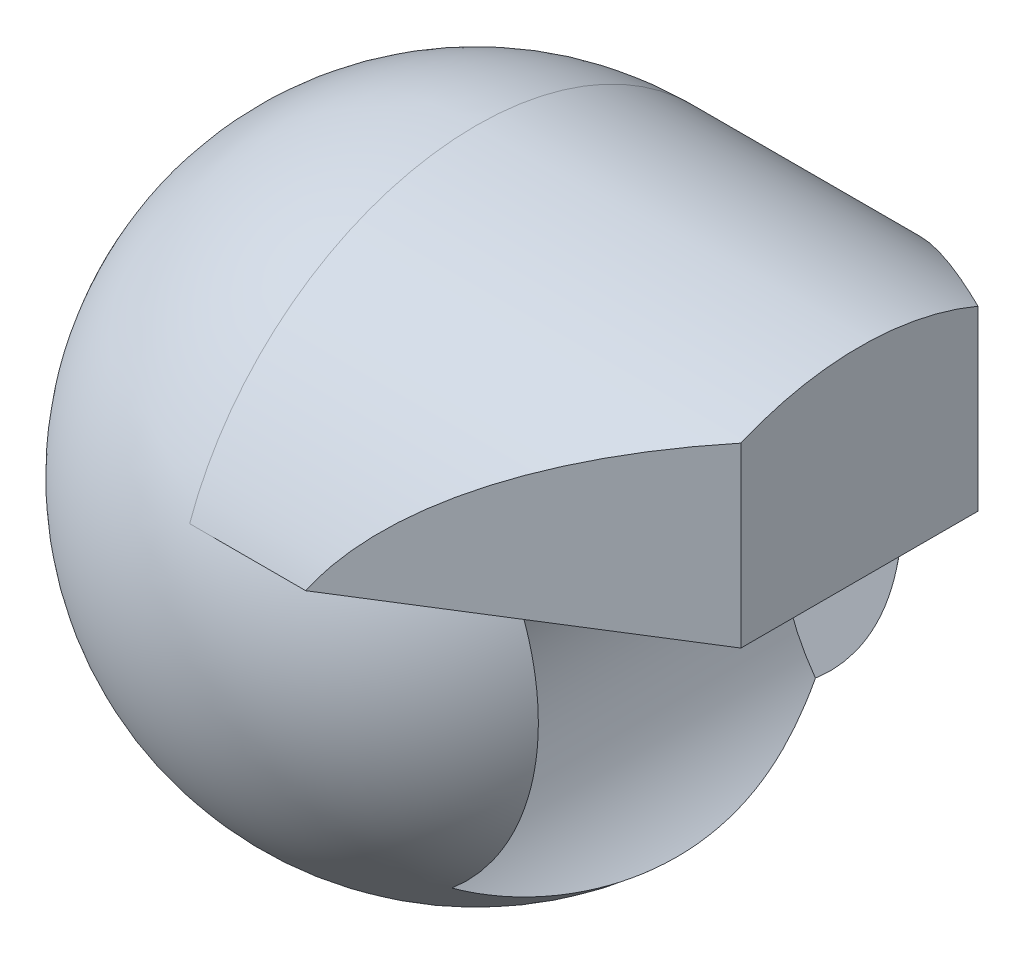
ISO-10303-21;
HEADER;
FILE_DESCRIPTION(('STEP AP214'),'2;1');
FILE_NAME('part.step','',(''),(''),'','','');
FILE_SCHEMA(('AUTOMOTIVE_DESIGN { 1 0 10303 214 1 1 1 1 }'));
ENDSEC;
DATA;
#1=APPLICATION_CONTEXT('core data for automotive mechanical design processes');
#2=APPLICATION_PROTOCOL_DEFINITION('international standard','automotive_design',2000,#1);
#3=PRODUCT_CONTEXT('',#1,'mechanical');
#4=PRODUCT('Part','Part','',(#3));
#5=PRODUCT_RELATED_PRODUCT_CATEGORY('part','',(#4));
#6=PRODUCT_DEFINITION_FORMATION('','',#4);
#7=PRODUCT_DEFINITION_CONTEXT('part definition',#1,'design');
#8=PRODUCT_DEFINITION('design','',#6,#7);
#9=PRODUCT_DEFINITION_SHAPE('','',#8);
#10=(LENGTH_UNIT() NAMED_UNIT(*) SI_UNIT(.MILLI.,.METRE.));
#11=(NAMED_UNIT(*) PLANE_ANGLE_UNIT() SI_UNIT($,.RADIAN.));
#12=(NAMED_UNIT(*) SI_UNIT($,.STERADIAN.) SOLID_ANGLE_UNIT());
#13=UNCERTAINTY_MEASURE_WITH_UNIT(LENGTH_MEASURE(1.E-05),#10,'distance_accuracy_value','');
#14=(GEOMETRIC_REPRESENTATION_CONTEXT(3) GLOBAL_UNCERTAINTY_ASSIGNED_CONTEXT((#13)) GLOBAL_UNIT_ASSIGNED_CONTEXT((#10,
#11,#12)) REPRESENTATION_CONTEXT('',''));
#15=CARTESIAN_POINT('',(0.,0.,0.));
#16=DIRECTION('',(0.,0.,1.));
#17=DIRECTION('',(1.,0.,0.));
#18=AXIS2_PLACEMENT_3D('',#15,#16,#17);
#19=CARTESIAN_POINT('',(-97.79,58.42,92.0465300812584));
#20=DIRECTION('',(0.,-1.,0.));
#21=DIRECTION('',(0.,0.,-1.));
#22=AXIS2_PLACEMENT_3D('',#19,#20,#21);
#23=PLANE('',#22);
#24=DIRECTION('',(-0.846795240839696,0.,0.531918997678445));
#25=VECTOR('',#24,1.);
#26=CARTESIAN_POINT('',(-87.2338353662045,58.42,108.851551169868));
#27=LINE('',#26,#25);
#28=CARTESIAN_POINT('',(25.4,58.42,38.1));
#29=VERTEX_POINT('',#28);
#30=CARTESIAN_POINT('',(-60.4808674478676,58.42,92.0465300812584));
#31=VERTEX_POINT('',#30);
#32=EDGE_CURVE('E104',#29,#31,#27,.T.);
#33=ORIENTED_EDGE('',*,*,#32,.T.);
#34=DIRECTION('',(1.,0.,0.));
#35=VECTOR('',#34,1.);
#36=CARTESIAN_POINT('',(-97.79,58.42,92.0465300812584));
#37=LINE('',#36,#35);
#38=CARTESIAN_POINT('',(-97.79,58.42,92.0465300812584));
#39=VERTEX_POINT('',#38);
#40=EDGE_CURVE('E162',#39,#31,#37,.T.);
#41=ORIENTED_EDGE('',*,*,#40,.F.);
#42=CARTESIAN_POINT('',(-97.79,58.42,0.));
#43=DIRECTION('',(0.,-1.,0.));
#44=DIRECTION('',(0.,0.,-1.));
#45=AXIS2_PLACEMENT_3D('',#42,#43,#44);
#46=CIRCLE('',#45,92.0465300812584);
#47=CARTESIAN_POINT('',(-97.79,58.42,-92.0465300812584));
#48=VERTEX_POINT('',#47);
#49=EDGE_CURVE('E165',#48,#39,#46,.T.);
#50=ORIENTED_EDGE('',*,*,#49,.F.);
#51=DIRECTION('',(1.,0.,0.));
#52=VECTOR('',#51,1.);
#53=CARTESIAN_POINT('',(-97.79,58.42,-92.0465300812584));
#54=LINE('',#53,#52);
#55=CARTESIAN_POINT('',(-60.4808674478676,58.42,-92.0465300812584));
#56=VERTEX_POINT('',#55);
#57=EDGE_CURVE('E163',#48,#56,#54,.T.);
#58=ORIENTED_EDGE('',*,*,#57,.T.);
#59=DIRECTION('',(0.846795240839696,0.,0.531918997678445));
#60=VECTOR('',#59,1.);
#61=CARTESIAN_POINT('',(-4.3134470678453,58.42,-56.7646620335598));
#62=LINE('',#61,#60);
#63=CARTESIAN_POINT('',(25.4,58.42,-38.1));
#64=VERTEX_POINT('',#63);
#65=EDGE_CURVE('E152',#56,#64,#62,.T.);
#66=ORIENTED_EDGE('',*,*,#65,.T.);
#67=DIRECTION('',(0.,0.,-1.));
#68=VECTOR('',#67,1.);
#69=CARTESIAN_POINT('',(25.4,58.42,92.0465300812584));
#70=LINE('',#69,#68);
#71=EDGE_CURVE('E151',#29,#64,#70,.T.);
#72=ORIENTED_EDGE('',*,*,#71,.F.);
#73=EDGE_LOOP('',(#33,#41,#50,#58,#66,#72));
#74=FACE_BOUND('',#73,.T.);
#75=ADVANCED_FACE('F32',(#74),#23,.T.);
#76=CARTESIAN_POINT('',(-97.79,25.4000000000001,0.));
#77=DIRECTION('',(1.,0.,0.));
#78=DIRECTION('',(0.,0.,-1.));
#79=AXIS2_PLACEMENT_3D('',#76,#77,#78);
#80=CYLINDRICAL_SURFACE('',#79,97.79);
#81=CARTESIAN_POINT('',(25.4,25.4000000000001,0.));
#82=DIRECTION('',(1.,0.,0.));
#83=DIRECTION('',(0.,0.,-1.));
#84=AXIS2_PLACEMENT_3D('',#81,#82,#83);
#85=CIRCLE('',#84,97.79);
#86=CARTESIAN_POINT('',(25.4,115.462612109576,-38.1));
#87=VERTEX_POINT('',#86);
#88=CARTESIAN_POINT('',(25.4,115.462612109576,38.1));
#89=VERTEX_POINT('',#88);
#90=EDGE_CURVE('E142',#87,#89,#85,.T.);
#91=ORIENTED_EDGE('',*,*,#90,.F.);
#92=CARTESIAN_POINT('',(86.0537815283973,25.4000000000001,0.));
#93=DIRECTION('',(0.531918997678445,0.,-0.846795240839696));
#94=DIRECTION('',(0.846795240839696,0.,0.531918997678445));
#95=AXIS2_PLACEMENT_3D('',#92,#93,#94);
#96=ELLIPSE('',#95,183.843781528397,97.79);
#97=EDGE_CURVE('E144',#87,#56,#96,.F.);
#98=ORIENTED_EDGE('',*,*,#97,.T.);
#99=ORIENTED_EDGE('',*,*,#57,.F.);
#100=CARTESIAN_POINT('',(-97.79,25.4000000000001,0.));
#101=DIRECTION('',(1.,0.,0.));
#102=DIRECTION('',(0.,0.,-1.));
#103=AXIS2_PLACEMENT_3D('',#100,#101,#102);
#104=CIRCLE('',#103,97.79);
#105=EDGE_CURVE('E155',#48,#39,#104,.T.);
#106=ORIENTED_EDGE('',*,*,#105,.T.);
#107=ORIENTED_EDGE('',*,*,#40,.T.);
#108=CARTESIAN_POINT('',(86.0537815283973,25.4000000000001,0.));
#109=DIRECTION('',(0.531918997678445,0.,0.846795240839696));
#110=DIRECTION('',(0.846795240839696,0.,-0.531918997678445));
#111=AXIS2_PLACEMENT_3D('',#108,#109,#110);
#112=ELLIPSE('',#111,183.843781528397,97.79);
#113=EDGE_CURVE('E101',#31,#89,#112,.F.);
#114=ORIENTED_EDGE('',*,*,#113,.T.);
#115=EDGE_LOOP('',(#91,#98,#99,#106,#107,#114));
#116=FACE_BOUND('',#115,.T.);
#117=ADVANCED_FACE('F132',(#116),#80,.T.);
#118=CARTESIAN_POINT('',(25.4,25.4000000000001,0.));
#119=DIRECTION('',(1.,0.,0.));
#120=DIRECTION('',(0.,0.,-1.));
#121=AXIS2_PLACEMENT_3D('',#118,#119,#120);
#122=PLANE('',#121);
#123=ORIENTED_EDGE('',*,*,#71,.T.);
#124=DIRECTION('',(0.,1.,0.));
#125=VECTOR('',#124,1.);
#126=CARTESIAN_POINT('',(25.4,25.4000000000001,-38.1));
#127=LINE('',#126,#125);
#128=EDGE_CURVE('E170',#64,#87,#127,.T.);
#129=ORIENTED_EDGE('',*,*,#128,.T.);
#130=ORIENTED_EDGE('',*,*,#90,.T.);
#131=DIRECTION('',(0.,-1.,0.));
#132=VECTOR('',#131,1.);
#133=CARTESIAN_POINT('',(25.4,25.4000000000001,38.1));
#134=LINE('',#133,#132);
#135=EDGE_CURVE('E168',#89,#29,#134,.T.);
#136=ORIENTED_EDGE('',*,*,#135,.T.);
#137=EDGE_LOOP('',(#123,#129,#130,#136));
#138=FACE_BOUND('',#137,.T.);
#139=ADVANCED_FACE('F129',(#138),#122,.T.);
#140=CARTESIAN_POINT('',(-97.79,25.4000000000001,0.));
#141=DIRECTION('',(-1.,0.,0.));
#142=DIRECTION('',(0.,1.,0.));
#143=AXIS2_PLACEMENT_3D('',#140,#141,#142);
#144=SPHERICAL_SURFACE('',#143,97.79);
#145=CARTESIAN_POINT('',(-47.1561449316364,-34.4846979860126,58.4202));
#146=CARTESIAN_POINT('',(-46.7181443119124,-35.0835918353474,57.4266937590784));
#147=CARTESIAN_POINT('',(-46.280380585085,-35.6583171168986,56.4186435629936));
#148=CARTESIAN_POINT('',(-45.40944490911,-36.7610276784263,54.3755851217401));
#149=CARTESIAN_POINT('',(-44.9762722236779,-37.2890205560567,53.3405812941771));
#150=CARTESIAN_POINT('',(-44.118824921171,-38.2996642146155,51.2462354007672));
#151=CARTESIAN_POINT('',(-43.6945436447559,-38.7823499458063,50.1869128928672));
#152=CARTESIAN_POINT('',(-42.8582345311935,-39.7046055948252,48.044876403603));
#153=CARTESIAN_POINT('',(-42.4462072260852,-40.1441736424823,46.9621614101047));
#154=CARTESIAN_POINT('',(-41.6378895804718,-40.9819643417161,44.7749308028108));
#155=CARTESIAN_POINT('',(-41.2416010988394,-41.3801821184311,43.6704126368237));
#156=CARTESIAN_POINT('',(-40.4681001029724,-42.1369438469339,41.4412852901977));
#157=CARTESIAN_POINT('',(-40.0908877888478,-42.4954873825836,40.316675898968));
#158=CARTESIAN_POINT('',(-39.358549729647,-43.1746502267992,38.0486888910573));
#159=CARTESIAN_POINT('',(-39.0034286709313,-43.4952615014718,36.9053073567015));
#160=CARTESIAN_POINT('',(-38.3182348533714,-44.1000919702463,34.601534214176));
#161=CARTESIAN_POINT('',(-37.9881623474016,-44.3843107969729,33.4411424344227));
#162=CARTESIAN_POINT('',(-37.3403511607589,-44.9308674318116,31.048057107138));
#163=CARTESIAN_POINT('',(-37.0239935847234,-45.1914682100434,29.814592374747));
#164=CARTESIAN_POINT('',(-36.4245775914727,-45.6759791634607,27.332453464369));
#165=CARTESIAN_POINT('',(-36.1415193915764,-45.8998890991976,26.08377918718));
#166=CARTESIAN_POINT('',(-35.6112501356884,-46.3125052153197,23.5731283549151));
#167=CARTESIAN_POINT('',(-35.3640375243885,-46.5012129232002,22.3111523795382));
#168=CARTESIAN_POINT('',(-34.9076797078038,-46.8447637294658,19.7757587050327));
#169=CARTESIAN_POINT('',(-34.6985344267451,-46.9996068952592,18.5023410286842));
#170=CARTESIAN_POINT('',(-34.3203807813526,-47.2764502110241,15.9471273564822));
#171=CARTESIAN_POINT('',(-34.1513384145974,-47.3984781961093,14.6653394120913));
#172=CARTESIAN_POINT('',(-33.854718126457,-47.6107943710308,12.0943575926834));
#173=CARTESIAN_POINT('',(-33.7271401146003,-47.7010826301203,10.8051637338317));
#174=CARTESIAN_POINT('',(-33.5146310266546,-47.8506301425341,8.22143822004332));
#175=CARTESIAN_POINT('',(-33.4297009258271,-47.9098886862802,6.92690644372291));
#176=CARTESIAN_POINT('',(-33.30328565386,-47.9978487604818,4.33467896552923));
#177=CARTESIAN_POINT('',(-33.2618008233636,-48.0265500513458,3.0369832389282));
#178=CARTESIAN_POINT('',(-33.2217624683487,-48.0542566637722,0.380423175986142));
#179=CARTESIAN_POINT('',(-33.2252881174259,-48.05182378972,-0.978488222914789));
#180=CARTESIAN_POINT('',(-33.2803028187182,-48.0137370228756,-3.69488015998536));
#181=CARTESIAN_POINT('',(-33.3317922830663,-47.9780828446265,-5.05236068575977));
#182=CARTESIAN_POINT('',(-33.4822071186251,-47.8732347464761,-7.76343186527447));
#183=CARTESIAN_POINT('',(-33.5811339081945,-47.804039823718,-9.11702240148803));
#184=CARTESIAN_POINT('',(-33.8254117741434,-47.631504912915,-11.8178161189258));
#185=CARTESIAN_POINT('',(-33.9707627645085,-47.5281649881336,-13.1650193119797));
#186=CARTESIAN_POINT('',(-34.3066148011702,-47.2863134039878,-15.852258413281));
#187=CARTESIAN_POINT('',(-34.4971696877342,-47.147759789075,-17.1922838110965));
#188=CARTESIAN_POINT('',(-34.9214174594961,-46.8343946791256,-19.8612187838434));
#189=CARTESIAN_POINT('',(-35.1551104531337,-46.6595830929442,-21.1901283308232));
#190=CARTESIAN_POINT('',(-35.6633164718398,-46.2723059864783,-23.8346464660566));
#191=CARTESIAN_POINT('',(-35.9378313271204,-46.0598387778552,-25.1502544551206));
#192=CARTESIAN_POINT('',(-36.5249653904034,-45.5956503751494,-27.7659459573163));
#193=CARTESIAN_POINT('',(-36.8375844592003,-45.3439293244711,-29.066029527144));
#194=CARTESIAN_POINT('',(-37.4889774234531,-44.8067663679358,-31.6138095336976));
#195=CARTESIAN_POINT('',(-37.8268206045947,-44.5224147294543,-32.8619740481943));
#196=CARTESIAN_POINT('',(-38.5325715967992,-43.913035304088,-35.3397306965868));
#197=CARTESIAN_POINT('',(-38.9004791739913,-43.5880078336097,-36.5693229748678));
#198=CARTESIAN_POINT('',(-39.6628858814189,-42.8954198921035,-39.007816546304));
#199=CARTESIAN_POINT('',(-40.0573793743349,-42.5278684261573,-40.216722158148));
#200=CARTESIAN_POINT('',(-40.869359116706,-41.7481578043762,-42.6122170064663));
#201=CARTESIAN_POINT('',(-41.2868451100598,-41.335999145348,-43.7988064913106));
#202=CARTESIAN_POINT('',(-42.1407541295536,-40.4651089471077,-46.147408195648));
#203=CARTESIAN_POINT('',(-42.5771714947463,-40.0063912759642,-47.3094276097003));
#204=CARTESIAN_POINT('',(-43.4648220309004,-39.0401832870889,-49.6071788718745));
#205=CARTESIAN_POINT('',(-43.9160544491291,-38.5326954447862,-50.7429120505808));
#206=CARTESIAN_POINT('',(-44.8292609227896,-37.4663479727354,-52.986973466973));
#207=CARTESIAN_POINT('',(-45.2912437561126,-36.9074451777297,-54.0952776677682));
#208=CARTESIAN_POINT('',(-46.2207703115897,-35.7364594590425,-56.2813190943617));
#209=CARTESIAN_POINT('',(-46.6883150843949,-35.1243663454699,-57.3590504104972));
#210=CARTESIAN_POINT('',(-47.1561449316364,-34.4846979860126,-58.4202));
#211=B_SPLINE_CURVE_WITH_KNOTS('',3,(#145,#146,#147,#148,#149,#150,#151,#152,#153,#154,#155,
#156,#157,#158,#159,#160,#161,#162,#163,#164,#165,#166,#167,#168,#169,#170,#171,#172,#173,#174,
#175,#176,#177,#178,#179,#180,#181,#182,#183,#184,#185,#186,#187,#188,#189,#190,#191,#192,#193,
#194,#195,#196,#197,#198,#199,#200,#201,#202,#203,#204,#205,#206,#207,#208,#209,#210),
.UNSPECIFIED.,.F.,.F.,(4,2,2,2,2,2,2,2,2,2,2,2,2,2,2,2,2,2,2,2,2,2,2,2,2,2,2,2,2,2,2,2,4),(0.,
3.71949787375793,7.43838992452471,11.1543892038037,14.8705495883107,18.587147581785,
22.30378455449,26.0212072914492,29.7386675521863,33.6369689569246,37.5352958014218,
41.433453450341,45.3316033398032,49.226436161573,53.1212604851216,57.0161738704592,
60.9111177945795,64.986607754542,69.0621327338125,73.1377795774018,77.2134188696995,
81.2939370579654,85.3744655038849,89.4551769518741,93.5358734923122,97.5067105058994,
101.477516633318,105.447483417944,109.417405992144,113.386149536042,117.354691744589,
121.326596677784,125.299264209949),.UNSPECIFIED.);
#212=CARTESIAN_POINT('',(-47.1560567657706,-34.4848185482166,58.42));
#213=VERTEX_POINT('',#212);
#214=CARTESIAN_POINT('',(-47.1560567657706,-34.4848185482166,-58.42));
#215=VERTEX_POINT('',#214);
#216=EDGE_CURVE('E96',#213,#215,#211,.T.);
#217=ORIENTED_EDGE('',*,*,#216,.F.);
#218=CARTESIAN_POINT('',(-97.79,25.4000000000001,58.42));
#219=DIRECTION('',(0.,0.,1.));
#220=DIRECTION('',(1.,0.,0.));
#221=AXIS2_PLACEMENT_3D('',#218,#219,#220);
#222=CIRCLE('',#221,78.4218572848157);
#223=CARTESIAN_POINT('',(-24.4134297249863,53.0742955588028,58.42));
#224=VERTEX_POINT('',#223);
#225=EDGE_CURVE('E11',#213,#224,#222,.T.);
#226=ORIENTED_EDGE('',*,*,#225,.T.);
#227=CARTESIAN_POINT('',(-24.4135654179331,53.074233141745,-58.4202));
#228=CARTESIAN_POINT('',(-23.7394781241417,53.3842729875694,-57.4266937590784));
#229=CARTESIAN_POINT('',(-23.0773593829811,53.6733145112015,-56.4186435629936));
#230=CARTESIAN_POINT('',(-21.7798792309868,54.2128001823477,-54.3755851217401));
#231=CARTESIAN_POINT('',(-21.1445134795482,54.4632506088427,-53.3405812941771));
#232=CARTESIAN_POINT('',(-19.9036209840636,54.9288709432479,-51.2462354007672));
#233=CARTESIAN_POINT('',(-19.2980714139313,55.144068142868,-50.1869128928672));
#234=CARTESIAN_POINT('',(-18.1186591074272,55.5427597866748,-48.044876403603));
#235=CARTESIAN_POINT('',(-17.5447977459597,55.7262528560005,-46.9621614101047));
#236=CARTESIAN_POINT('',(-16.4309434852176,56.0647781250121,-44.7749308028108));
#237=CARTESIAN_POINT('',(-15.8909545821954,56.219806970648,-43.6704126368237));
#238=CARTESIAN_POINT('',(-14.8469487155597,56.5044889946047,-41.4412852901977));
#239=CARTESIAN_POINT('',(-14.342932129275,56.6341419067714,-40.316675898968));
#240=CARTESIAN_POINT('',(-13.372649511246,56.8710656140442,-38.0486888910574));
#241=CARTESIAN_POINT('',(-12.9063914831799,56.9783316713708,-36.9053073567015));
#242=CARTESIAN_POINT('',(-12.0134677256962,57.1732614713029,-34.601534214176));
#243=CARTESIAN_POINT('',(-11.5868023959719,57.260925016031,-33.4411424344227));
#244=CARTESIAN_POINT('',(-10.7548949088095,57.4231391381931,-31.0480571071381));
#245=CARTESIAN_POINT('',(-10.3517046046771,57.4968443631345,-29.814592374747));
#246=CARTESIAN_POINT('',(-9.59226950225827,57.6284069800143,-27.332453464369));
#247=CARTESIAN_POINT('',(-9.23602501034864,57.6862642685288,-26.08377918718));
#248=CARTESIAN_POINT('',(-8.57198387376135,57.7886698930989,-23.5731283549151));
#249=CARTESIAN_POINT('',(-8.26418512701638,57.833218806682,-22.3111523795383));
#250=CARTESIAN_POINT('',(-7.69832340301655,57.9112580439647,-19.7757587050327));
#251=CARTESIAN_POINT('',(-7.44026032676163,57.9447483896766,-18.5023410286842));
#252=CARTESIAN_POINT('',(-6.97518070629539,58.0025700779457,-15.9471273564822));
#253=CARTESIAN_POINT('',(-6.76812091172253,58.0269091899587,-14.6653394120913));
#254=CARTESIAN_POINT('',(-6.40567069970059,58.0680382219809,-12.0943575926834));
#255=CARTESIAN_POINT('',(-6.25028016951395,58.0848281584617,-10.8051637338317));
#256=CARTESIAN_POINT('',(-5.99185560236494,58.1120552409808,-8.22143822004333));
#257=CARTESIAN_POINT('',(-5.88882276270418,58.1224922417429,-6.92690644372292));
#258=CARTESIAN_POINT('',(-5.73558100772755,58.1378141271279,-4.33467896552924));
#259=CARTESIAN_POINT('',(-5.68537250659369,58.1426989682179,-3.03698323892821));
#260=CARTESIAN_POINT('',(-5.63691170217744,58.1474187859868,-0.380423175986157));
#261=CARTESIAN_POINT('',(-5.6411756563295,58.1470091855007,0.978488222914769));
#262=CARTESIAN_POINT('',(-5.70777125205172,58.1405095087899,3.69488015998534));
#263=CARTESIAN_POINT('',(-5.77010339257757,58.1344193837549,5.05236068575975));
#264=CARTESIAN_POINT('',(-5.95252964761114,58.1160235169271,7.76343186527446));
#265=CARTESIAN_POINT('',(-6.07262548923291,58.1037175892836,9.11702240148801));
#266=CARTESIAN_POINT('',(-6.36998997747831,58.0718690042453,11.8178161189258));
#267=CARTESIAN_POINT('',(-6.54725851817269,58.0523263602586,13.1650193119797));
#268=CARTESIAN_POINT('',(-6.95835486670676,58.0044873436961,15.852258413281));
#269=CARTESIAN_POINT('',(-7.1922501268969,57.9761805201481,17.1922838110964));
#270=CARTESIAN_POINT('',(-7.71537075712539,57.9088851250013,19.8612187838433));
#271=CARTESIAN_POINT('',(-8.00459626625172,57.8698965265509,21.1901283308232));
#272=CARTESIAN_POINT('',(-8.63703181141546,57.778889956155,23.8346464660566));
#273=CARTESIAN_POINT('',(-8.98024426794977,57.7268713999514,25.1502544551206));
#274=CARTESIAN_POINT('',(-9.7190599601959,57.6070855311492,27.7659459573163));
#275=CARTESIAN_POINT('',(-10.1146630045105,57.5393182760844,29.066029527144));
#276=CARTESIAN_POINT('',(-10.9451281025485,57.3870535175467,31.6138095336976));
#277=CARTESIAN_POINT('',(-11.3786465090985,57.3030555382059,32.8619740481943));
#278=CARTESIAN_POINT('',(-12.2917427116623,57.1141559036885,35.3397306965868));
#279=CARTESIAN_POINT('',(-12.7713201493885,57.009254411111,36.5693229748678));
#280=CARTESIAN_POINT('',(-13.7744039770399,56.7752354397552,39.007816546304));
#281=CARTESIAN_POINT('',(-14.297901059904,56.6461230844012,40.2167221581481));
#282=CARTESIAN_POINT('',(-15.3866899223872,56.3601185937511,42.6122170064663));
#283=CARTESIAN_POINT('',(-15.9519812365063,56.2032267678327,43.7988064913106));
#284=CARTESIAN_POINT('',(-17.1217718478764,55.8579728373493,46.147408195648));
#285=CARTESIAN_POINT('',(-17.7262594508583,55.6696200930044,47.3094276097003));
#286=CARTESIAN_POINT('',(-18.9719128590004,55.2575170247256,49.6071788718745));
#287=CARTESIAN_POINT('',(-19.6130768019107,55.0337684970044,50.7429120505808));
#288=CARTESIAN_POINT('',(-20.9297885741947,54.5466205693547,52.986973466973));
#289=CARTESIAN_POINT('',(-21.6053650782332,54.2831877321053,54.0952776677682));
#290=CARTESIAN_POINT('',(-22.9872561098006,53.7125702178452,56.2813190943617));
#291=CARTESIAN_POINT('',(-23.6935765140735,53.405377150267,57.3590504104972));
#292=CARTESIAN_POINT('',(-24.4135654179331,53.074233141745,58.4202));
#293=B_SPLINE_CURVE_WITH_KNOTS('',3,(#227,#228,#229,#230,#231,#232,#233,#234,#235,#236,#237,
#238,#239,#240,#241,#242,#243,#244,#245,#246,#247,#248,#249,#250,#251,#252,#253,#254,#255,#256,
#257,#258,#259,#260,#261,#262,#263,#264,#265,#266,#267,#268,#269,#270,#271,#272,#273,#274,#275,
#276,#277,#278,#279,#280,#281,#282,#283,#284,#285,#286,#287,#288,#289,#290,#291,#292),
.UNSPECIFIED.,.F.,.F.,(4,2,2,2,2,2,2,2,2,2,2,2,2,2,2,2,2,2,2,2,2,2,2,2,2,2,2,2,2,2,2,2,4),(0.,
3.71949787375793,7.43838992452471,11.1543892038037,14.8705495883107,18.587147581785,
22.30378455449,26.0212072914492,29.7386675521863,33.6369689569246,37.5352958014218,
41.433453450341,45.3316033398032,49.226436161573,53.1212604851216,57.0161738704592,
60.9111177945795,64.986607754542,69.0621327338125,73.1377795774017,77.2134188696994,
81.2939370579654,85.3744655038849,89.4551769518741,93.5358734923122,97.5067105058994,
101.477516633318,105.447483417944,109.417405992144,113.386149536042,117.354691744589,
121.326596677784,125.299264209949),.UNSPECIFIED.);
#294=CARTESIAN_POINT('',(-24.4134297249863,53.0742955588028,-58.42));
#295=VERTEX_POINT('',#294);
#296=EDGE_CURVE('E89',#295,#224,#293,.T.);
#297=ORIENTED_EDGE('',*,*,#296,.F.);
#298=CARTESIAN_POINT('',(-97.79,25.4000000000001,-58.42));
#299=DIRECTION('',(0.,0.,1.));
#300=DIRECTION('',(1.,0.,0.));
#301=AXIS2_PLACEMENT_3D('',#298,#299,#300);
#302=CIRCLE('',#301,78.4218572848157);
#303=EDGE_CURVE('E41',#215,#295,#302,.T.);
#304=ORIENTED_EDGE('',*,*,#303,.F.);
#305=EDGE_LOOP('',(#217,#226,#297,#304));
#306=FACE_BOUND('',#305,.T.);
#307=CARTESIAN_POINT('',(-45.7736412170249,25.4000000000001,82.8081066017139));
#308=VERTEX_POINT('',#307);
#309=VERTEX_LOOP('',#308);
#310=FACE_BOUND('',#309,.T.);
#311=CARTESIAN_POINT('',(-45.7736412170249,25.4000000000001,-82.8081066017139));
#312=VERTEX_POINT('',#311);
#313=VERTEX_LOOP('',#312);
#314=FACE_BOUND('',#313,.T.);
#315=ORIENTED_EDGE('',*,*,#105,.F.);
#316=ORIENTED_EDGE('',*,*,#49,.T.);
#317=EDGE_LOOP('',(#315,#316));
#318=FACE_BOUND('',#317,.T.);
#319=ADVANCED_FACE('F34',(#306,#310,#314,#318),#144,.T.);
#320=CARTESIAN_POINT('',(25.4,123.19,38.1));
#321=DIRECTION('',(0.531918997678445,0.,0.846795240839696));
#322=DIRECTION('',(0.846795240839696,0.,-0.531918997678445));
#323=AXIS2_PLACEMENT_3D('',#320,#321,#322);
#324=PLANE('',#323);
#325=ORIENTED_EDGE('',*,*,#135,.F.);
#326=ORIENTED_EDGE('',*,*,#113,.F.);
#327=ORIENTED_EDGE('',*,*,#32,.F.);
#328=EDGE_LOOP('',(#325,#326,#327));
#329=FACE_BOUND('',#328,.T.);
#330=ADVANCED_FACE('F120',(#329),#324,.T.);
#331=CARTESIAN_POINT('',(25.4,123.19,-38.1));
#332=DIRECTION('',(0.531918997678445,0.,-0.846795240839696));
#333=DIRECTION('',(-0.846795240839696,0.,-0.531918997678445));
#334=AXIS2_PLACEMENT_3D('',#331,#332,#333);
#335=PLANE('',#334);
#336=ORIENTED_EDGE('',*,*,#97,.F.);
#337=ORIENTED_EDGE('',*,*,#128,.F.);
#338=ORIENTED_EDGE('',*,*,#65,.F.);
#339=EDGE_LOOP('',(#336,#337,#338));
#340=FACE_BOUND('',#339,.T.);
#341=ADVANCED_FACE('F124',(#340),#335,.T.);
#342=CARTESIAN_POINT('',(0.,0.,58.42));
#343=DIRECTION('',(0.,0.,1.));
#344=DIRECTION('',(1.,0.,0.));
#345=AXIS2_PLACEMENT_3D('',#342,#343,#344);
#346=PLANE('',#345);
#347=CARTESIAN_POINT('',(0.,0.,58.42));
#348=DIRECTION('',(0.,0.,1.));
#349=DIRECTION('',(1.,0.,0.));
#350=AXIS2_PLACEMENT_3D('',#347,#348,#349);
#351=CIRCLE('',#350,58.42);
#352=EDGE_CURVE('E92',#224,#213,#351,.T.);
#353=ORIENTED_EDGE('',*,*,#352,.F.);
#354=ORIENTED_EDGE('',*,*,#225,.F.);
#355=EDGE_LOOP('',(#353,#354));
#356=FACE_BOUND('',#355,.T.);
#357=ADVANCED_FACE('F99',(#356),#346,.F.);
#358=CARTESIAN_POINT('',(0.,0.,-58.42));
#359=DIRECTION('',(0.,0.,1.));
#360=DIRECTION('',(1.,0.,0.));
#361=AXIS2_PLACEMENT_3D('',#358,#359,#360);
#362=PLANE('',#361);
#363=ORIENTED_EDGE('',*,*,#303,.T.);
#364=CARTESIAN_POINT('',(0.,0.,-58.42));
#365=DIRECTION('',(0.,0.,1.));
#366=DIRECTION('',(1.,0.,0.));
#367=AXIS2_PLACEMENT_3D('',#364,#365,#366);
#368=CIRCLE('',#367,58.42);
#369=EDGE_CURVE('E47',#295,#215,#368,.T.);
#370=ORIENTED_EDGE('',*,*,#369,.T.);
#371=EDGE_LOOP('',(#363,#370));
#372=FACE_BOUND('',#371,.T.);
#373=ADVANCED_FACE('F118',(#372),#362,.T.);
#374=CARTESIAN_POINT('',(0.,0.,58.42));
#375=DIRECTION('',(0.,0.,-1.));
#376=DIRECTION('',(-1.,0.,0.));
#377=AXIS2_PLACEMENT_3D('',#374,#375,#376);
#378=CYLINDRICAL_SURFACE('',#377,58.42);
#379=ORIENTED_EDGE('',*,*,#216,.T.);
#380=ORIENTED_EDGE('',*,*,#369,.F.);
#381=ORIENTED_EDGE('',*,*,#296,.T.);
#382=ORIENTED_EDGE('',*,*,#352,.T.);
#383=EDGE_LOOP('',(#379,#380,#381,#382));
#384=FACE_BOUND('',#383,.T.);
#385=ADVANCED_FACE('F91',(#384),#378,.F.);
#386=CLOSED_SHELL('',(#75,#117,#139,#319,#330,#341,#357,#373,#385));
#387=MANIFOLD_SOLID_BREP('B2',#386);
#388=ADVANCED_BREP_SHAPE_REPRESENTATION('',(#18,#387),#14);
#389=SHAPE_DEFINITION_REPRESENTATION(#9,#388);
ENDSEC;
END-ISO-10303-21;
